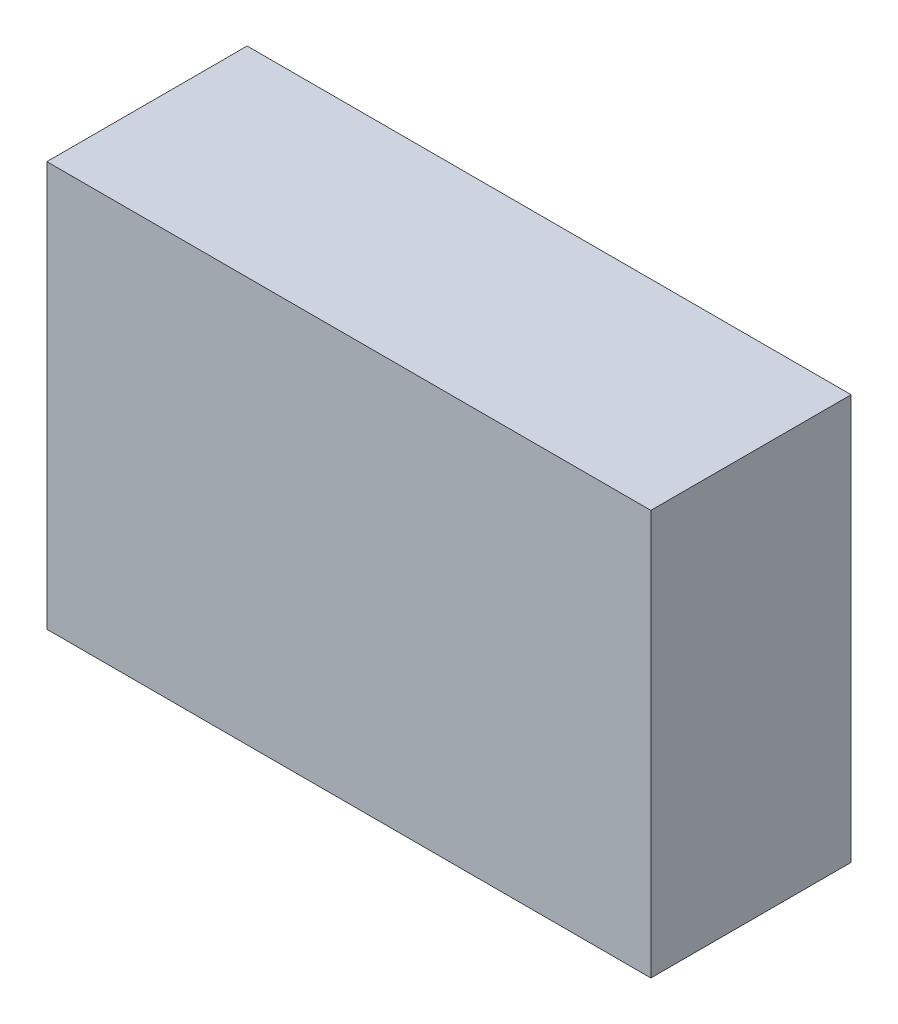
ISO-10303-21;
HEADER;
FILE_DESCRIPTION(('STEP AP214'),'2;1');
FILE_NAME('part.step','',(''),(''),'','','');
FILE_SCHEMA(('AUTOMOTIVE_DESIGN { 1 0 10303 214 1 1 1 1 }'));
ENDSEC;
DATA;
#1=APPLICATION_CONTEXT('core data for automotive mechanical design processes');
#2=APPLICATION_PROTOCOL_DEFINITION('international standard','automotive_design',2000,#1);
#3=PRODUCT_CONTEXT('',#1,'mechanical');
#4=PRODUCT('Part','Part','',(#3));
#5=PRODUCT_RELATED_PRODUCT_CATEGORY('part','',(#4));
#6=PRODUCT_DEFINITION_FORMATION('','',#4);
#7=PRODUCT_DEFINITION_CONTEXT('part definition',#1,'design');
#8=PRODUCT_DEFINITION('design','',#6,#7);
#9=PRODUCT_DEFINITION_SHAPE('','',#8);
#10=(LENGTH_UNIT() NAMED_UNIT(*) SI_UNIT(.MILLI.,.METRE.));
#11=(NAMED_UNIT(*) PLANE_ANGLE_UNIT() SI_UNIT($,.RADIAN.));
#12=(NAMED_UNIT(*) SI_UNIT($,.STERADIAN.) SOLID_ANGLE_UNIT());
#13=UNCERTAINTY_MEASURE_WITH_UNIT(LENGTH_MEASURE(1.E-05),#10,'distance_accuracy_value','');
#14=(GEOMETRIC_REPRESENTATION_CONTEXT(3) GLOBAL_UNCERTAINTY_ASSIGNED_CONTEXT((#13)) GLOBAL_UNIT_ASSIGNED_CONTEXT((#10,
#11,#12)) REPRESENTATION_CONTEXT('',''));
#15=CARTESIAN_POINT('',(0.,0.,0.));
#16=DIRECTION('',(0.,0.,1.));
#17=DIRECTION('',(1.,0.,0.));
#18=AXIS2_PLACEMENT_3D('',#15,#16,#17);
#19=CARTESIAN_POINT('',(-47.5,-31.85,31.5));
#20=DIRECTION('',(1.,0.,0.));
#21=DIRECTION('',(0.,0.,-1.));
#22=AXIS2_PLACEMENT_3D('',#19,#20,#21);
#23=PLANE('',#22);
#24=DIRECTION('',(0.,-1.,0.));
#25=VECTOR('',#24,1.);
#26=CARTESIAN_POINT('',(-47.5,-31.85,0.));
#27=LINE('',#26,#25);
#28=CARTESIAN_POINT('',(-47.5,31.85,0.));
#29=VERTEX_POINT('',#28);
#30=CARTESIAN_POINT('',(-47.5,-31.85,0.));
#31=VERTEX_POINT('',#30);
#32=EDGE_CURVE('E100',#29,#31,#27,.T.);
#33=ORIENTED_EDGE('',*,*,#32,.T.);
#34=DIRECTION('',(0.,0.,-1.));
#35=VECTOR('',#34,1.);
#36=CARTESIAN_POINT('',(-47.5,-31.85,31.5));
#37=LINE('',#36,#35);
#38=CARTESIAN_POINT('',(-47.5,-31.85,31.5));
#39=VERTEX_POINT('',#38);
#40=EDGE_CURVE('E11',#39,#31,#37,.T.);
#41=ORIENTED_EDGE('',*,*,#40,.F.);
#42=DIRECTION('',(0.,-1.,0.));
#43=VECTOR('',#42,1.);
#44=CARTESIAN_POINT('',(-47.5,-31.85,31.5));
#45=LINE('',#44,#43);
#46=CARTESIAN_POINT('',(-47.5,31.85,31.5));
#47=VERTEX_POINT('',#46);
#48=EDGE_CURVE('E88',#47,#39,#45,.T.);
#49=ORIENTED_EDGE('',*,*,#48,.F.);
#50=DIRECTION('',(0.,0.,-1.));
#51=VECTOR('',#50,1.);
#52=CARTESIAN_POINT('',(-47.5,31.85,31.5));
#53=LINE('',#52,#51);
#54=EDGE_CURVE('E96',#47,#29,#53,.T.);
#55=ORIENTED_EDGE('',*,*,#54,.T.);
#56=EDGE_LOOP('',(#33,#41,#49,#55));
#57=FACE_BOUND('',#56,.T.);
#58=ADVANCED_FACE('F37',(#57),#23,.F.);
#59=CARTESIAN_POINT('',(47.5,-31.85,31.5));
#60=DIRECTION('',(0.,1.,0.));
#61=DIRECTION('',(-1.,0.,0.));
#62=AXIS2_PLACEMENT_3D('',#59,#60,#61);
#63=PLANE('',#62);
#64=DIRECTION('',(1.,0.,0.));
#65=VECTOR('',#64,1.);
#66=CARTESIAN_POINT('',(47.5,-31.85,0.));
#67=LINE('',#66,#65);
#68=CARTESIAN_POINT('',(47.5,-31.85,0.));
#69=VERTEX_POINT('',#68);
#70=EDGE_CURVE('E92',#31,#69,#67,.T.);
#71=ORIENTED_EDGE('',*,*,#70,.T.);
#72=DIRECTION('',(0.,0.,-1.));
#73=VECTOR('',#72,1.);
#74=CARTESIAN_POINT('',(47.5,-31.85,31.5));
#75=LINE('',#74,#73);
#76=CARTESIAN_POINT('',(47.5,-31.85,31.5));
#77=VERTEX_POINT('',#76);
#78=EDGE_CURVE('E45',#77,#69,#75,.T.);
#79=ORIENTED_EDGE('',*,*,#78,.F.);
#80=DIRECTION('',(1.,0.,0.));
#81=VECTOR('',#80,1.);
#82=CARTESIAN_POINT('',(47.5,-31.85,31.5));
#83=LINE('',#82,#81);
#84=EDGE_CURVE('E83',#39,#77,#83,.T.);
#85=ORIENTED_EDGE('',*,*,#84,.F.);
#86=ORIENTED_EDGE('',*,*,#40,.T.);
#87=EDGE_LOOP('',(#71,#79,#85,#86));
#88=FACE_BOUND('',#87,.T.);
#89=ADVANCED_FACE('F91',(#88),#63,.F.);
#90=CARTESIAN_POINT('',(47.5,-31.85,31.5));
#91=DIRECTION('',(-1.,0.,0.));
#92=DIRECTION('',(0.,0.,1.));
#93=AXIS2_PLACEMENT_3D('',#90,#91,#92);
#94=PLANE('',#93);
#95=DIRECTION('',(0.,1.,0.));
#96=VECTOR('',#95,1.);
#97=CARTESIAN_POINT('',(47.5,-31.85,0.));
#98=LINE('',#97,#96);
#99=CARTESIAN_POINT('',(47.5,31.85,0.));
#100=VERTEX_POINT('',#99);
#101=EDGE_CURVE('E70',#69,#100,#98,.T.);
#102=ORIENTED_EDGE('',*,*,#101,.T.);
#103=DIRECTION('',(0.,0.,-1.));
#104=VECTOR('',#103,1.);
#105=CARTESIAN_POINT('',(47.5,31.85,31.5));
#106=LINE('',#105,#104);
#107=CARTESIAN_POINT('',(47.5,31.85,31.5));
#108=VERTEX_POINT('',#107);
#109=EDGE_CURVE('E93',#108,#100,#106,.T.);
#110=ORIENTED_EDGE('',*,*,#109,.F.);
#111=DIRECTION('',(0.,1.,0.));
#112=VECTOR('',#111,1.);
#113=CARTESIAN_POINT('',(47.5,-31.85,31.5));
#114=LINE('',#113,#112);
#115=EDGE_CURVE('E86',#77,#108,#114,.T.);
#116=ORIENTED_EDGE('',*,*,#115,.F.);
#117=ORIENTED_EDGE('',*,*,#78,.T.);
#118=EDGE_LOOP('',(#102,#110,#116,#117));
#119=FACE_BOUND('',#118,.T.);
#120=ADVANCED_FACE('F94',(#119),#94,.F.);
#121=CARTESIAN_POINT('',(47.5,31.85,31.5));
#122=DIRECTION('',(0.,-1.,0.));
#123=DIRECTION('',(0.,0.,-1.));
#124=AXIS2_PLACEMENT_3D('',#121,#122,#123);
#125=PLANE('',#124);
#126=DIRECTION('',(-1.,0.,0.));
#127=VECTOR('',#126,1.);
#128=CARTESIAN_POINT('',(47.5,31.85,0.));
#129=LINE('',#128,#127);
#130=EDGE_CURVE('E76',#100,#29,#129,.T.);
#131=ORIENTED_EDGE('',*,*,#130,.T.);
#132=ORIENTED_EDGE('',*,*,#54,.F.);
#133=DIRECTION('',(-1.,0.,0.));
#134=VECTOR('',#133,1.);
#135=CARTESIAN_POINT('',(47.5,31.85,31.5));
#136=LINE('',#135,#134);
#137=EDGE_CURVE('E53',#108,#47,#136,.T.);
#138=ORIENTED_EDGE('',*,*,#137,.F.);
#139=ORIENTED_EDGE('',*,*,#109,.T.);
#140=EDGE_LOOP('',(#131,#132,#138,#139));
#141=FACE_BOUND('',#140,.T.);
#142=ADVANCED_FACE('F107',(#141),#125,.F.);
#143=CARTESIAN_POINT('',(0.,0.,31.5));
#144=DIRECTION('',(0.,0.,1.));
#145=DIRECTION('',(1.,0.,0.));
#146=AXIS2_PLACEMENT_3D('',#143,#144,#145);
#147=PLANE('',#146);
#148=ORIENTED_EDGE('',*,*,#48,.T.);
#149=ORIENTED_EDGE('',*,*,#84,.T.);
#150=ORIENTED_EDGE('',*,*,#115,.T.);
#151=ORIENTED_EDGE('',*,*,#137,.T.);
#152=EDGE_LOOP('',(#148,#149,#150,#151));
#153=FACE_BOUND('',#152,.T.);
#154=ADVANCED_FACE('F84',(#153),#147,.T.);
#155=CARTESIAN_POINT('',(0.,0.,0.));
#156=DIRECTION('',(0.,0.,1.));
#157=DIRECTION('',(1.,0.,0.));
#158=AXIS2_PLACEMENT_3D('',#155,#156,#157);
#159=PLANE('',#158);
#160=ORIENTED_EDGE('',*,*,#32,.F.);
#161=ORIENTED_EDGE('',*,*,#130,.F.);
#162=ORIENTED_EDGE('',*,*,#101,.F.);
#163=ORIENTED_EDGE('',*,*,#70,.F.);
#164=EDGE_LOOP('',(#160,#161,#162,#163));
#165=FACE_BOUND('',#164,.T.);
#166=ADVANCED_FACE('F110',(#165),#159,.F.);
#167=CLOSED_SHELL('',(#58,#89,#120,#142,#154,#166));
#168=MANIFOLD_SOLID_BREP('B2',#167);
#169=ADVANCED_BREP_SHAPE_REPRESENTATION('',(#18,#168),#14);
#170=SHAPE_DEFINITION_REPRESENTATION(#9,#169);
ENDSEC;
END-ISO-10303-21;
